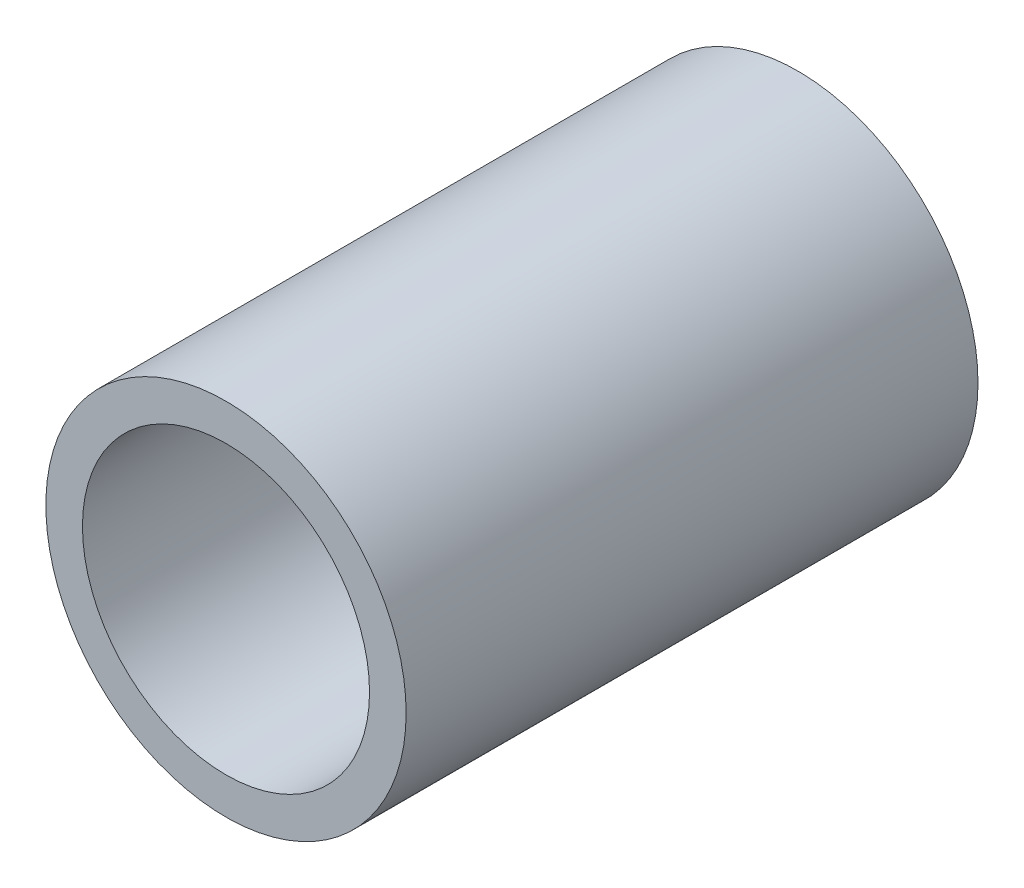
ISO-10303-21;
HEADER;
FILE_DESCRIPTION(('STEP AP214'),'2;1');
FILE_NAME('part.step','',(''),(''),'','','');
FILE_SCHEMA(('AUTOMOTIVE_DESIGN { 1 0 10303 214 1 1 1 1 }'));
ENDSEC;
DATA;
#1=APPLICATION_CONTEXT('core data for automotive mechanical design processes');
#2=APPLICATION_PROTOCOL_DEFINITION('international standard','automotive_design',2000,#1);
#3=PRODUCT_CONTEXT('',#1,'mechanical');
#4=PRODUCT('Part','Part','',(#3));
#5=PRODUCT_RELATED_PRODUCT_CATEGORY('part','',(#4));
#6=PRODUCT_DEFINITION_FORMATION('','',#4);
#7=PRODUCT_DEFINITION_CONTEXT('part definition',#1,'design');
#8=PRODUCT_DEFINITION('design','',#6,#7);
#9=PRODUCT_DEFINITION_SHAPE('','',#8);
#10=(LENGTH_UNIT() NAMED_UNIT(*) SI_UNIT(.MILLI.,.METRE.));
#11=(NAMED_UNIT(*) PLANE_ANGLE_UNIT() SI_UNIT($,.RADIAN.));
#12=(NAMED_UNIT(*) SI_UNIT($,.STERADIAN.) SOLID_ANGLE_UNIT());
#13=UNCERTAINTY_MEASURE_WITH_UNIT(LENGTH_MEASURE(1.E-05),#10,'distance_accuracy_value','');
#14=(GEOMETRIC_REPRESENTATION_CONTEXT(3) GLOBAL_UNCERTAINTY_ASSIGNED_CONTEXT((#13)) GLOBAL_UNIT_ASSIGNED_CONTEXT((#10,
#11,#12)) REPRESENTATION_CONTEXT('',''));
#15=CARTESIAN_POINT('',(0.,0.,0.));
#16=DIRECTION('',(0.,0.,1.));
#17=DIRECTION('',(1.,0.,0.));
#18=AXIS2_PLACEMENT_3D('',#15,#16,#17);
#19=CARTESIAN_POINT('',(0.,0.,6.35));
#20=DIRECTION('',(0.,0.,1.));
#21=DIRECTION('',(1.,0.,0.));
#22=AXIS2_PLACEMENT_3D('',#19,#20,#21);
#23=PLANE('',#22);
#24=CARTESIAN_POINT('',(0.,0.,6.35));
#25=DIRECTION('',(0.,0.,1.));
#26=DIRECTION('',(1.,0.,0.));
#27=AXIS2_PLACEMENT_3D('',#24,#25,#26);
#28=CIRCLE('',#27,4.0005);
#29=CARTESIAN_POINT('',(4.0005,0.,6.35));
#30=VERTEX_POINT('',#29);
#31=EDGE_CURVE('E10',#30,#30,#28,.T.);
#32=ORIENTED_EDGE('',*,*,#31,.T.);
#33=EDGE_LOOP('',(#32));
#34=FACE_BOUND('',#33,.T.);
#35=CARTESIAN_POINT('',(0.,0.,6.35));
#36=DIRECTION('',(0.,0.,1.));
#37=DIRECTION('',(1.,0.,0.));
#38=AXIS2_PLACEMENT_3D('',#35,#36,#37);
#39=CIRCLE('',#38,3.1877);
#40=CARTESIAN_POINT('',(3.1877,0.,6.35));
#41=VERTEX_POINT('',#40);
#42=EDGE_CURVE('E46',#41,#41,#39,.T.);
#43=ORIENTED_EDGE('',*,*,#42,.F.);
#44=EDGE_LOOP('',(#43));
#45=FACE_BOUND('',#44,.T.);
#46=ADVANCED_FACE('F35',(#34,#45),#23,.T.);
#47=CARTESIAN_POINT('',(0.,0.,-6.35));
#48=DIRECTION('',(0.,0.,1.));
#49=DIRECTION('',(1.,0.,0.));
#50=AXIS2_PLACEMENT_3D('',#47,#48,#49);
#51=PLANE('',#50);
#52=CARTESIAN_POINT('',(0.,0.,-6.35));
#53=DIRECTION('',(0.,0.,1.));
#54=DIRECTION('',(1.,0.,0.));
#55=AXIS2_PLACEMENT_3D('',#52,#53,#54);
#56=CIRCLE('',#55,4.0005);
#57=CARTESIAN_POINT('',(4.0005,0.,-6.35));
#58=VERTEX_POINT('',#57);
#59=EDGE_CURVE('E39',#58,#58,#56,.T.);
#60=ORIENTED_EDGE('',*,*,#59,.F.);
#61=EDGE_LOOP('',(#60));
#62=FACE_BOUND('',#61,.T.);
#63=CARTESIAN_POINT('',(0.,0.,-6.35));
#64=DIRECTION('',(0.,0.,1.));
#65=DIRECTION('',(1.,0.,0.));
#66=AXIS2_PLACEMENT_3D('',#63,#64,#65);
#67=CIRCLE('',#66,3.1877);
#68=CARTESIAN_POINT('',(3.1877,0.,-6.35));
#69=VERTEX_POINT('',#68);
#70=EDGE_CURVE('E48',#69,#69,#67,.T.);
#71=ORIENTED_EDGE('',*,*,#70,.T.);
#72=EDGE_LOOP('',(#71));
#73=FACE_BOUND('',#72,.T.);
#74=ADVANCED_FACE('F58',(#62,#73),#51,.F.);
#75=CARTESIAN_POINT('',(0.,0.,6.35));
#76=DIRECTION('',(0.,0.,-1.));
#77=DIRECTION('',(-1.,0.,0.));
#78=AXIS2_PLACEMENT_3D('',#75,#76,#77);
#79=CYLINDRICAL_SURFACE('',#78,4.0005);
#80=ORIENTED_EDGE('',*,*,#31,.F.);
#81=EDGE_LOOP('',(#80));
#82=FACE_BOUND('',#81,.T.);
#83=ORIENTED_EDGE('',*,*,#59,.T.);
#84=EDGE_LOOP('',(#83));
#85=FACE_BOUND('',#84,.T.);
#86=ADVANCED_FACE('F37',(#82,#85),#79,.T.);
#87=CARTESIAN_POINT('',(0.,0.,6.35));
#88=DIRECTION('',(0.,0.,-1.));
#89=DIRECTION('',(-1.,0.,0.));
#90=AXIS2_PLACEMENT_3D('',#87,#88,#89);
#91=CYLINDRICAL_SURFACE('',#90,3.1877);
#92=ORIENTED_EDGE('',*,*,#42,.T.);
#93=EDGE_LOOP('',(#92));
#94=FACE_BOUND('',#93,.T.);
#95=ORIENTED_EDGE('',*,*,#70,.F.);
#96=EDGE_LOOP('',(#95));
#97=FACE_BOUND('',#96,.T.);
#98=ADVANCED_FACE('F54',(#94,#97),#91,.F.);
#99=CLOSED_SHELL('',(#46,#74,#86,#98));
#100=MANIFOLD_SOLID_BREP('B2',#99);
#101=ADVANCED_BREP_SHAPE_REPRESENTATION('',(#18,#100),#14);
#102=SHAPE_DEFINITION_REPRESENTATION(#9,#101);
ENDSEC;
END-ISO-10303-21;
